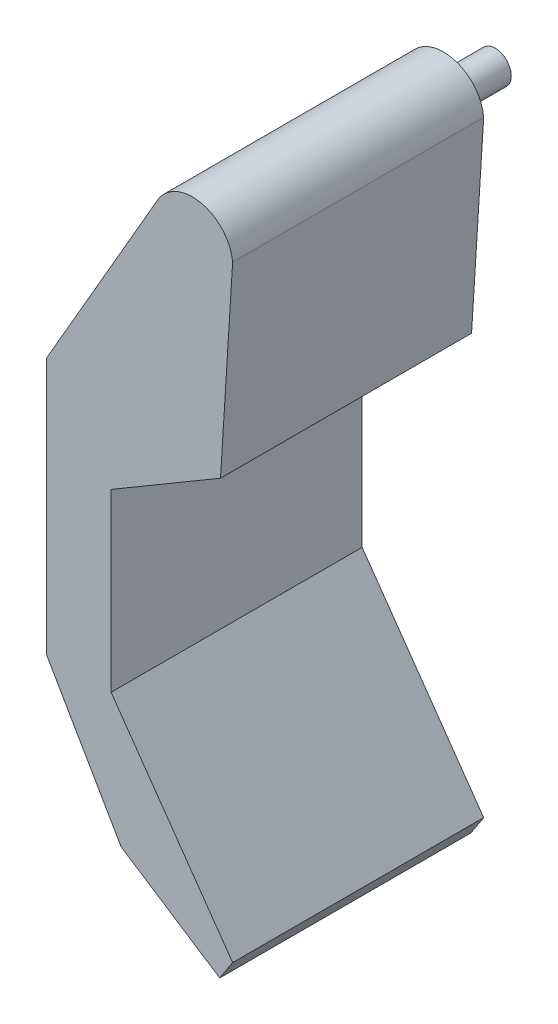
ISO-10303-21;
HEADER;
FILE_DESCRIPTION(('STEP AP214'),'2;1');
FILE_NAME('part.step','',(''),(''),'','','');
FILE_SCHEMA(('AUTOMOTIVE_DESIGN { 1 0 10303 214 1 1 1 1 }'));
ENDSEC;
DATA;
#1=APPLICATION_CONTEXT('core data for automotive mechanical design processes');
#2=APPLICATION_PROTOCOL_DEFINITION('international standard','automotive_design',2000,#1);
#3=PRODUCT_CONTEXT('',#1,'mechanical');
#4=PRODUCT('Part','Part','',(#3));
#5=PRODUCT_RELATED_PRODUCT_CATEGORY('part','',(#4));
#6=PRODUCT_DEFINITION_FORMATION('','',#4);
#7=PRODUCT_DEFINITION_CONTEXT('part definition',#1,'design');
#8=PRODUCT_DEFINITION('design','',#6,#7);
#9=PRODUCT_DEFINITION_SHAPE('','',#8);
#10=(LENGTH_UNIT() NAMED_UNIT(*) SI_UNIT(.MILLI.,.METRE.));
#11=(NAMED_UNIT(*) PLANE_ANGLE_UNIT() SI_UNIT($,.RADIAN.));
#12=(NAMED_UNIT(*) SI_UNIT($,.STERADIAN.) SOLID_ANGLE_UNIT());
#13=UNCERTAINTY_MEASURE_WITH_UNIT(LENGTH_MEASURE(1.E-05),#10,'distance_accuracy_value','');
#14=(GEOMETRIC_REPRESENTATION_CONTEXT(3) GLOBAL_UNCERTAINTY_ASSIGNED_CONTEXT((#13)) GLOBAL_UNIT_ASSIGNED_CONTEXT((#10,
#11,#12)) REPRESENTATION_CONTEXT('',''));
#15=CARTESIAN_POINT('',(0.,0.,0.));
#16=DIRECTION('',(0.,0.,1.));
#17=DIRECTION('',(1.,0.,0.));
#18=AXIS2_PLACEMENT_3D('',#15,#16,#17);
#19=CARTESIAN_POINT('',(5.76690652211303,63.6033246271349,39.));
#20=DIRECTION('',(0.,0.,-1.));
#21=DIRECTION('',(-1.,0.,0.));
#22=AXIS2_PLACEMENT_3D('',#19,#20,#21);
#23=CYLINDRICAL_SURFACE('',#22,6.26046499619758);
#24=CARTESIAN_POINT('',(5.76690652211303,63.6033246271349,0.));
#25=DIRECTION('',(0.,0.,1.));
#26=DIRECTION('',(1.,0.,0.));
#27=AXIS2_PLACEMENT_3D('',#24,#25,#26);
#28=CIRCLE('',#27,6.26046499619758);
#29=CARTESIAN_POINT('',(0.441332655320446,66.8944771544346,0.));
#30=VERTEX_POINT('',#29);
#31=CARTESIAN_POINT('',(11.9997557720586,64.1907020152488,0.));
#32=VERTEX_POINT('',#31);
#33=EDGE_CURVE('E143',#30,#32,#28,.F.);
#34=ORIENTED_EDGE('',*,*,#33,.F.);
#35=DIRECTION('',(0.,0.,-1.));
#36=VECTOR('',#35,1.);
#37=CARTESIAN_POINT('',(0.441332655320446,66.8944771544346,39.));
#38=LINE('',#37,#36);
#39=CARTESIAN_POINT('',(0.441332655320446,66.8944771544346,39.));
#40=VERTEX_POINT('',#39);
#41=EDGE_CURVE('E11',#40,#30,#38,.T.);
#42=ORIENTED_EDGE('',*,*,#41,.F.);
#43=CARTESIAN_POINT('',(5.76690652211303,63.6033246271349,39.));
#44=DIRECTION('',(0.,0.,1.));
#45=DIRECTION('',(1.,0.,0.));
#46=AXIS2_PLACEMENT_3D('',#43,#44,#45);
#47=CIRCLE('',#46,6.26046499619758);
#48=CARTESIAN_POINT('',(11.9997557720586,64.1907020152488,39.));
#49=VERTEX_POINT('',#48);
#50=EDGE_CURVE('E167',#40,#49,#47,.F.);
#51=ORIENTED_EDGE('',*,*,#50,.T.);
#52=DIRECTION('',(0.,0.,-1.));
#53=VECTOR('',#52,1.);
#54=CARTESIAN_POINT('',(11.9997557720586,64.1907020152488,39.));
#55=LINE('',#54,#53);
#56=EDGE_CURVE('E53',#49,#32,#55,.T.);
#57=ORIENTED_EDGE('',*,*,#56,.T.);
#58=EDGE_LOOP('',(#34,#42,#51,#57));
#59=FACE_BOUND('',#58,.T.);
#60=ADVANCED_FACE('F37',(#59),#23,.T.);
#61=CARTESIAN_POINT('',(-28.6351588028188,16.5325166430951,39.));
#62=DIRECTION('',(0.866025403784438,-0.500000000000001,0.));
#63=DIRECTION('',(0.500000000000001,0.866025403784438,0.));
#64=AXIS2_PLACEMENT_3D('',#61,#62,#63);
#65=PLANE('',#64);
#66=DIRECTION('',(-0.500000000000001,-0.866025403784438,0.));
#67=VECTOR('',#66,1.);
#68=CARTESIAN_POINT('',(-28.6351588028188,16.5325166430951,0.));
#69=LINE('',#68,#67);
#70=CARTESIAN_POINT('',(-16.8791754203684,36.8944771544346,0.));
#71=VERTEX_POINT('',#70);
#72=EDGE_CURVE('E145',#30,#71,#69,.T.);
#73=ORIENTED_EDGE('',*,*,#72,.T.);
#74=DIRECTION('',(0.,0.,-1.));
#75=VECTOR('',#74,1.);
#76=CARTESIAN_POINT('',(-16.8791754203684,36.8944771544346,39.));
#77=LINE('',#76,#75);
#78=CARTESIAN_POINT('',(-16.8791754203684,36.8944771544346,39.));
#79=VERTEX_POINT('',#78);
#80=EDGE_CURVE('E45',#79,#71,#77,.T.);
#81=ORIENTED_EDGE('',*,*,#80,.F.);
#82=DIRECTION('',(-0.500000000000001,-0.866025403784438,0.));
#83=VECTOR('',#82,1.);
#84=CARTESIAN_POINT('',(-28.6351588028188,16.5325166430951,39.));
#85=LINE('',#84,#83);
#86=EDGE_CURVE('E303',#40,#79,#85,.T.);
#87=ORIENTED_EDGE('',*,*,#86,.F.);
#88=ORIENTED_EDGE('',*,*,#41,.T.);
#89=EDGE_LOOP('',(#73,#81,#87,#88));
#90=FACE_BOUND('',#89,.T.);
#91=ADVANCED_FACE('F225',(#90),#65,.F.);
#92=CARTESIAN_POINT('',(-16.8791754203684,0.,39.));
#93=DIRECTION('',(1.,0.,0.));
#94=DIRECTION('',(0.,1.,0.));
#95=AXIS2_PLACEMENT_3D('',#92,#93,#94);
#96=PLANE('',#95);
#97=DIRECTION('',(0.,-1.,0.));
#98=VECTOR('',#97,1.);
#99=CARTESIAN_POINT('',(-16.8791754203684,0.,0.));
#100=LINE('',#99,#98);
#101=CARTESIAN_POINT('',(-16.8791754203684,-3.10552284556541,0.));
#102=VERTEX_POINT('',#101);
#103=EDGE_CURVE('E148',#71,#102,#100,.T.);
#104=ORIENTED_EDGE('',*,*,#103,.T.);
#105=DIRECTION('',(0.,0.,-1.));
#106=VECTOR('',#105,1.);
#107=CARTESIAN_POINT('',(-16.8791754203684,-3.10552284556541,39.));
#108=LINE('',#107,#106);
#109=CARTESIAN_POINT('',(-16.8791754203684,-3.10552284556541,39.));
#110=VERTEX_POINT('',#109);
#111=EDGE_CURVE('E178',#110,#102,#108,.T.);
#112=ORIENTED_EDGE('',*,*,#111,.F.);
#113=DIRECTION('',(0.,-1.,0.));
#114=VECTOR('',#113,1.);
#115=CARTESIAN_POINT('',(-16.8791754203684,0.,39.));
#116=LINE('',#115,#114);
#117=EDGE_CURVE('E187',#79,#110,#116,.T.);
#118=ORIENTED_EDGE('',*,*,#117,.F.);
#119=ORIENTED_EDGE('',*,*,#80,.T.);
#120=EDGE_LOOP('',(#104,#112,#118,#119));
#121=FACE_BOUND('',#120,.T.);
#122=ADVANCED_FACE('F185',(#121),#96,.F.);
#123=CARTESIAN_POINT('',(-14.0041124034225,-8.08527806587781,39.));
#124=DIRECTION('',(0.866025403784438,0.500000000000001,0.));
#125=DIRECTION('',(-0.500000000000001,0.866025403784438,0.));
#126=AXIS2_PLACEMENT_3D('',#123,#124,#125);
#127=PLANE('',#126);
#128=DIRECTION('',(0.500000000000001,-0.866025403784438,0.));
#129=VECTOR('',#128,1.);
#130=CARTESIAN_POINT('',(-14.0041124034225,-8.08527806587781,0.));
#131=LINE('',#130,#129);
#132=CARTESIAN_POINT('',(-5.3321700365758,-23.1055228455654,0.));
#133=VERTEX_POINT('',#132);
#134=EDGE_CURVE('E150',#102,#133,#131,.T.);
#135=ORIENTED_EDGE('',*,*,#134,.T.);
#136=DIRECTION('',(0.,0.,-1.));
#137=VECTOR('',#136,1.);
#138=CARTESIAN_POINT('',(-5.3321700365758,-23.1055228455654,39.));
#139=LINE('',#138,#137);
#140=CARTESIAN_POINT('',(-5.3321700365758,-23.1055228455654,39.));
#141=VERTEX_POINT('',#140);
#142=EDGE_CURVE('E175',#141,#133,#139,.T.);
#143=ORIENTED_EDGE('',*,*,#142,.F.);
#144=DIRECTION('',(0.500000000000001,-0.866025403784438,0.));
#145=VECTOR('',#144,1.);
#146=CARTESIAN_POINT('',(-14.0041124034225,-8.08527806587781,39.));
#147=LINE('',#146,#145);
#148=EDGE_CURVE('E205',#110,#141,#147,.T.);
#149=ORIENTED_EDGE('',*,*,#148,.F.);
#150=ORIENTED_EDGE('',*,*,#111,.T.);
#151=EDGE_LOOP('',(#135,#143,#149,#150));
#152=FACE_BOUND('',#151,.T.);
#153=ADVANCED_FACE('F196',(#152),#127,.F.);
#154=CARTESIAN_POINT('',(-12.166888121993,-18.6456484373278,39.));
#155=DIRECTION('',(0.546478346859033,0.837473233252394,0.));
#156=DIRECTION('',(-0.837473233252394,0.546478346859033,0.));
#157=AXIS2_PLACEMENT_3D('',#154,#155,#156);
#158=PLANE('',#157);
#159=DIRECTION('',(0.837473233252394,-0.546478346859033,0.));
#160=VECTOR('',#159,1.);
#161=CARTESIAN_POINT('',(-12.166888121993,-18.6456484373278,0.));
#162=LINE('',#161,#160);
#163=CARTESIAN_POINT('',(9.99274151876576,-33.1055228455654,0.));
#164=VERTEX_POINT('',#163);
#165=EDGE_CURVE('E152',#133,#164,#162,.T.);
#166=ORIENTED_EDGE('',*,*,#165,.T.);
#167=DIRECTION('',(0.,0.,-1.));
#168=VECTOR('',#167,1.);
#169=CARTESIAN_POINT('',(9.99274151876576,-33.1055228455654,39.));
#170=LINE('',#169,#168);
#171=CARTESIAN_POINT('',(9.99274151876576,-33.1055228455654,39.));
#172=VERTEX_POINT('',#171);
#173=EDGE_CURVE('E173',#172,#164,#170,.T.);
#174=ORIENTED_EDGE('',*,*,#173,.F.);
#175=DIRECTION('',(0.837473233252394,-0.546478346859033,0.));
#176=VECTOR('',#175,1.);
#177=CARTESIAN_POINT('',(-12.166888121993,-18.6456484373278,39.));
#178=LINE('',#177,#176);
#179=EDGE_CURVE('E202',#141,#172,#178,.T.);
#180=ORIENTED_EDGE('',*,*,#179,.F.);
#181=ORIENTED_EDGE('',*,*,#142,.T.);
#182=EDGE_LOOP('',(#166,#174,#180,#181));
#183=FACE_BOUND('',#182,.T.);
#184=ADVANCED_FACE('F200',(#183),#158,.F.);
#185=CARTESIAN_POINT('',(22.1596296407588,-14.4598744082376,39.));
#186=DIRECTION('',(0.837473233252394,-0.546478346859033,0.));
#187=DIRECTION('',(0.546478346859033,0.837473233252394,0.));
#188=AXIS2_PLACEMENT_3D('',#185,#186,#187);
#189=PLANE('',#188);
#190=DIRECTION('',(-0.546478346859033,-0.837473233252394,0.));
#191=VECTOR('',#190,1.);
#192=CARTESIAN_POINT('',(22.1596296407588,-14.4598744082376,0.));
#193=LINE('',#192,#191);
#194=CARTESIAN_POINT('',(11.9997557720586,-30.0297912533631,0.));
#195=VERTEX_POINT('',#194);
#196=EDGE_CURVE('E155',#195,#164,#193,.T.);
#197=ORIENTED_EDGE('',*,*,#196,.F.);
#198=DIRECTION('',(0.,0.,-1.));
#199=VECTOR('',#198,1.);
#200=CARTESIAN_POINT('',(11.9997557720586,-30.0297912533631,39.));
#201=LINE('',#200,#199);
#202=CARTESIAN_POINT('',(11.9997557720586,-30.0297912533631,39.));
#203=VERTEX_POINT('',#202);
#204=EDGE_CURVE('E171',#203,#195,#201,.T.);
#205=ORIENTED_EDGE('',*,*,#204,.F.);
#206=DIRECTION('',(-0.546478346859033,-0.837473233252394,0.));
#207=VECTOR('',#206,1.);
#208=CARTESIAN_POINT('',(22.1596296407588,-14.4598744082376,39.));
#209=LINE('',#208,#207);
#210=EDGE_CURVE('E204',#203,#172,#209,.T.);
#211=ORIENTED_EDGE('',*,*,#210,.T.);
#212=ORIENTED_EDGE('',*,*,#173,.T.);
#213=EDGE_LOOP('',(#197,#205,#211,#212));
#214=FACE_BOUND('',#213,.T.);
#215=ADVANCED_FACE('F238',(#214),#189,.T.);
#216=CARTESIAN_POINT('',(-6.07156547642134,-4.25729921881468,39.));
#217=DIRECTION('',(0.818775295962724,0.574114112978556,0.));
#218=DIRECTION('',(-0.574114112978556,0.818775295962724,0.));
#219=AXIS2_PLACEMENT_3D('',#216,#217,#218);
#220=PLANE('',#219);
#221=DIRECTION('',(0.574114112978556,-0.818775295962724,0.));
#222=VECTOR('',#221,1.);
#223=CARTESIAN_POINT('',(-6.07156547642134,-4.25729921881468,0.));
#224=LINE('',#223,#222);
#225=CARTESIAN_POINT('',(-6.87917542036836,-3.10552284556541,0.));
#226=VERTEX_POINT('',#225);
#227=EDGE_CURVE('E158',#226,#195,#224,.T.);
#228=ORIENTED_EDGE('',*,*,#227,.F.);
#229=DIRECTION('',(0.,0.,-1.));
#230=VECTOR('',#229,1.);
#231=CARTESIAN_POINT('',(-6.87917542036836,-3.10552284556541,39.));
#232=LINE('',#231,#230);
#233=CARTESIAN_POINT('',(-6.87917542036836,-3.10552284556541,39.));
#234=VERTEX_POINT('',#233);
#235=EDGE_CURVE('E124',#234,#226,#232,.T.);
#236=ORIENTED_EDGE('',*,*,#235,.F.);
#237=DIRECTION('',(0.574114112978556,-0.818775295962724,0.));
#238=VECTOR('',#237,1.);
#239=CARTESIAN_POINT('',(-6.07156547642134,-4.25729921881468,39.));
#240=LINE('',#239,#238);
#241=EDGE_CURVE('E135',#234,#203,#240,.T.);
#242=ORIENTED_EDGE('',*,*,#241,.T.);
#243=ORIENTED_EDGE('',*,*,#204,.T.);
#244=EDGE_LOOP('',(#228,#236,#242,#243));
#245=FACE_BOUND('',#244,.T.);
#246=ADVANCED_FACE('F212',(#245),#220,.T.);
#247=CARTESIAN_POINT('',(-6.87917542036836,0.,39.));
#248=DIRECTION('',(1.,0.,0.));
#249=DIRECTION('',(0.,1.,0.));
#250=AXIS2_PLACEMENT_3D('',#247,#248,#249);
#251=PLANE('',#250);
#252=DIRECTION('',(0.,-1.,0.));
#253=VECTOR('',#252,1.);
#254=CARTESIAN_POINT('',(-6.87917542036836,0.,0.));
#255=LINE('',#254,#253);
#256=CARTESIAN_POINT('',(-6.87917542036836,24.1907020152488,0.));
#257=VERTEX_POINT('',#256);
#258=EDGE_CURVE('E120',#257,#226,#255,.T.);
#259=ORIENTED_EDGE('',*,*,#258,.F.);
#260=DIRECTION('',(0.,0.,-1.));
#261=VECTOR('',#260,1.);
#262=CARTESIAN_POINT('',(-6.87917542036836,24.1907020152488,39.));
#263=LINE('',#262,#261);
#264=CARTESIAN_POINT('',(-6.87917542036836,24.1907020152488,39.));
#265=VERTEX_POINT('',#264);
#266=EDGE_CURVE('E115',#265,#257,#263,.T.);
#267=ORIENTED_EDGE('',*,*,#266,.F.);
#268=DIRECTION('',(0.,-1.,0.));
#269=VECTOR('',#268,1.);
#270=CARTESIAN_POINT('',(-6.87917542036836,0.,39.));
#271=LINE('',#270,#269);
#272=EDGE_CURVE('E118',#265,#234,#271,.T.);
#273=ORIENTED_EDGE('',*,*,#272,.T.);
#274=ORIENTED_EDGE('',*,*,#235,.T.);
#275=EDGE_LOOP('',(#259,#267,#273,#274));
#276=FACE_BOUND('',#275,.T.);
#277=ADVANCED_FACE('F117',(#276),#251,.T.);
#278=CARTESIAN_POINT('',(-12.343162824505,20.9753639466543,39.));
#279=DIRECTION('',(0.507164002195062,-0.861849566268666,0.));
#280=DIRECTION('',(0.861849566268666,0.507164002195062,0.));
#281=AXIS2_PLACEMENT_3D('',#278,#279,#280);
#282=PLANE('',#281);
#283=DIRECTION('',(-0.861849566268666,-0.507164002195062,0.));
#284=VECTOR('',#283,1.);
#285=CARTESIAN_POINT('',(-12.343162824505,20.9753639466543,0.));
#286=LINE('',#285,#284);
#287=CARTESIAN_POINT('',(10.1143328439896,34.1907020152488,0.));
#288=VERTEX_POINT('',#287);
#289=EDGE_CURVE('E162',#288,#257,#286,.T.);
#290=ORIENTED_EDGE('',*,*,#289,.F.);
#291=DIRECTION('',(0.,0.,-1.));
#292=VECTOR('',#291,1.);
#293=CARTESIAN_POINT('',(10.1143328439896,34.1907020152488,39.));
#294=LINE('',#293,#292);
#295=CARTESIAN_POINT('',(10.1143328439896,34.1907020152488,39.));
#296=VERTEX_POINT('',#295);
#297=EDGE_CURVE('E84',#296,#288,#294,.T.);
#298=ORIENTED_EDGE('',*,*,#297,.F.);
#299=DIRECTION('',(-0.861849566268666,-0.507164002195062,0.));
#300=VECTOR('',#299,1.);
#301=CARTESIAN_POINT('',(-12.343162824505,20.9753639466543,39.));
#302=LINE('',#301,#300);
#303=EDGE_CURVE('E132',#296,#265,#302,.T.);
#304=ORIENTED_EDGE('',*,*,#303,.T.);
#305=ORIENTED_EDGE('',*,*,#266,.T.);
#306=EDGE_LOOP('',(#290,#298,#304,#305));
#307=FACE_BOUND('',#306,.T.);
#308=ADVANCED_FACE('F137',(#307),#282,.T.);
#309=CARTESIAN_POINT('',(7.93419657418711,-0.498643871225965,39.));
#310=DIRECTION('',(0.998030931366064,-0.0627236800306548,0.));
#311=DIRECTION('',(0.0627236800306548,0.998030931366064,0.));
#312=AXIS2_PLACEMENT_3D('',#309,#310,#311);
#313=PLANE('',#312);
#314=DIRECTION('',(-0.0627236800306548,-0.998030931366063,0.));
#315=VECTOR('',#314,1.);
#316=CARTESIAN_POINT('',(7.93419657418711,-0.498643871225965,0.));
#317=LINE('',#316,#315);
#318=EDGE_CURVE('E164',#32,#288,#317,.T.);
#319=ORIENTED_EDGE('',*,*,#318,.F.);
#320=ORIENTED_EDGE('',*,*,#56,.F.);
#321=DIRECTION('',(-0.0627236800306548,-0.998030931366063,0.));
#322=VECTOR('',#321,1.);
#323=CARTESIAN_POINT('',(7.93419657418711,-0.498643871225965,39.));
#324=LINE('',#323,#322);
#325=EDGE_CURVE('E138',#49,#296,#324,.T.);
#326=ORIENTED_EDGE('',*,*,#325,.T.);
#327=ORIENTED_EDGE('',*,*,#297,.T.);
#328=EDGE_LOOP('',(#319,#320,#326,#327));
#329=FACE_BOUND('',#328,.T.);
#330=ADVANCED_FACE('F214',(#329),#313,.T.);
#331=CARTESIAN_POINT('',(0.,0.,39.));
#332=DIRECTION('',(0.,0.,1.));
#333=DIRECTION('',(1.,0.,0.));
#334=AXIS2_PLACEMENT_3D('',#331,#332,#333);
#335=PLANE('',#334);
#336=ORIENTED_EDGE('',*,*,#50,.F.);
#337=ORIENTED_EDGE('',*,*,#86,.T.);
#338=ORIENTED_EDGE('',*,*,#117,.T.);
#339=ORIENTED_EDGE('',*,*,#148,.T.);
#340=ORIENTED_EDGE('',*,*,#179,.T.);
#341=ORIENTED_EDGE('',*,*,#210,.F.);
#342=ORIENTED_EDGE('',*,*,#241,.F.);
#343=ORIENTED_EDGE('',*,*,#272,.F.);
#344=ORIENTED_EDGE('',*,*,#303,.F.);
#345=ORIENTED_EDGE('',*,*,#325,.F.);
#346=EDGE_LOOP('',(#336,#337,#338,#339,#340,#341,#342,#343,#344,#345));
#347=FACE_BOUND('',#346,.T.);
#348=ADVANCED_FACE('F130',(#347),#335,.T.);
#349=CARTESIAN_POINT('',(0.,0.,0.));
#350=DIRECTION('',(0.,0.,1.));
#351=DIRECTION('',(1.,0.,0.));
#352=AXIS2_PLACEMENT_3D('',#349,#350,#351);
#353=PLANE('',#352);
#354=CARTESIAN_POINT('',(5.7844226517787,63.8812301614218,0.));
#355=DIRECTION('',(0.,0.,1.));
#356=DIRECTION('',(1.,0.,0.));
#357=AXIS2_PLACEMENT_3D('',#354,#355,#356);
#358=CIRCLE('',#357,2.5);
#359=CARTESIAN_POINT('',(8.2844226517787,63.8812301614218,0.));
#360=VERTEX_POINT('',#359);
#361=EDGE_CURVE('E297',#360,#360,#358,.T.);
#362=ORIENTED_EDGE('',*,*,#361,.T.);
#363=EDGE_LOOP('',(#362));
#364=FACE_BOUND('',#363,.T.);
#365=ORIENTED_EDGE('',*,*,#33,.T.);
#366=ORIENTED_EDGE('',*,*,#318,.T.);
#367=ORIENTED_EDGE('',*,*,#289,.T.);
#368=ORIENTED_EDGE('',*,*,#258,.T.);
#369=ORIENTED_EDGE('',*,*,#227,.T.);
#370=ORIENTED_EDGE('',*,*,#196,.T.);
#371=ORIENTED_EDGE('',*,*,#165,.F.);
#372=ORIENTED_EDGE('',*,*,#134,.F.);
#373=ORIENTED_EDGE('',*,*,#103,.F.);
#374=ORIENTED_EDGE('',*,*,#72,.F.);
#375=EDGE_LOOP('',(#365,#366,#367,#368,#369,#370,#371,#372,#373,#374));
#376=FACE_BOUND('',#375,.T.);
#377=ADVANCED_FACE('F192',(#364,#376),#353,.F.);
#378=CARTESIAN_POINT('',(5.7844226517787,63.8812301614218,-8.));
#379=DIRECTION('',(0.,0.,1.));
#380=DIRECTION('',(1.,0.,0.));
#381=AXIS2_PLACEMENT_3D('',#378,#379,#380);
#382=CYLINDRICAL_SURFACE('',#381,2.5);
#383=CARTESIAN_POINT('',(5.7844226517787,63.8812301614218,-8.));
#384=DIRECTION('',(0.,0.,1.));
#385=DIRECTION('',(1.,0.,0.));
#386=AXIS2_PLACEMENT_3D('',#383,#384,#385);
#387=CIRCLE('',#386,2.5);
#388=CARTESIAN_POINT('',(8.2844226517787,63.8812301614218,-8.));
#389=VERTEX_POINT('',#388);
#390=EDGE_CURVE('E146',#389,#389,#387,.T.);
#391=ORIENTED_EDGE('',*,*,#390,.T.);
#392=EDGE_LOOP('',(#391));
#393=FACE_BOUND('',#392,.T.);
#394=ORIENTED_EDGE('',*,*,#361,.F.);
#395=EDGE_LOOP('',(#394));
#396=FACE_BOUND('',#395,.T.);
#397=ADVANCED_FACE('F272',(#393,#396),#382,.T.);
#398=CARTESIAN_POINT('',(5.7844226517787,63.8812301614218,-8.));
#399=DIRECTION('',(0.,0.,1.));
#400=DIRECTION('',(1.,0.,0.));
#401=AXIS2_PLACEMENT_3D('',#398,#399,#400);
#402=PLANE('',#401);
#403=ORIENTED_EDGE('',*,*,#390,.F.);
#404=EDGE_LOOP('',(#403));
#405=FACE_BOUND('',#404,.T.);
#406=ADVANCED_FACE('F281',(#405),#402,.F.);
#407=CLOSED_SHELL('',(#60,#91,#122,#153,#184,#215,#246,#277,#308,#330,#348,#377,#397,#406));
#408=MANIFOLD_SOLID_BREP('B2',#407);
#409=ADVANCED_BREP_SHAPE_REPRESENTATION('',(#18,#408),#14);
#410=SHAPE_DEFINITION_REPRESENTATION(#9,#409);
ENDSEC;
END-ISO-10303-21;
